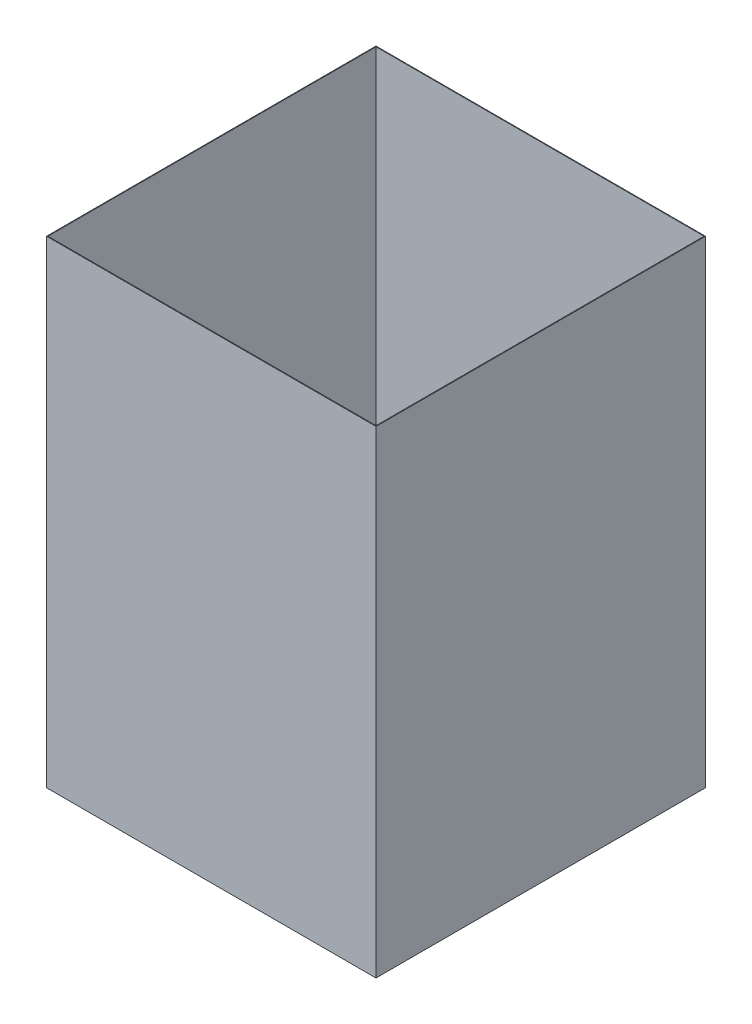
ISO-10303-21;
HEADER;
FILE_DESCRIPTION(('STEP AP214'),'2;1');
FILE_NAME('part.step','',(''),(''),'','','');
FILE_SCHEMA(('AUTOMOTIVE_DESIGN { 1 0 10303 214 1 1 1 1 }'));
ENDSEC;
DATA;
#1=APPLICATION_CONTEXT('core data for automotive mechanical design processes');
#2=APPLICATION_PROTOCOL_DEFINITION('international standard','automotive_design',2000,#1);
#3=PRODUCT_CONTEXT('',#1,'mechanical');
#4=PRODUCT('Part','Part','',(#3));
#5=PRODUCT_RELATED_PRODUCT_CATEGORY('part','',(#4));
#6=PRODUCT_DEFINITION_FORMATION('','',#4);
#7=PRODUCT_DEFINITION_CONTEXT('part definition',#1,'design');
#8=PRODUCT_DEFINITION('design','',#6,#7);
#9=PRODUCT_DEFINITION_SHAPE('','',#8);
#10=(LENGTH_UNIT() NAMED_UNIT(*) SI_UNIT(.MILLI.,.METRE.));
#11=(NAMED_UNIT(*) PLANE_ANGLE_UNIT() SI_UNIT($,.RADIAN.));
#12=(NAMED_UNIT(*) SI_UNIT($,.STERADIAN.) SOLID_ANGLE_UNIT());
#13=UNCERTAINTY_MEASURE_WITH_UNIT(LENGTH_MEASURE(1.E-05),#10,'distance_accuracy_value','');
#14=(GEOMETRIC_REPRESENTATION_CONTEXT(3) GLOBAL_UNCERTAINTY_ASSIGNED_CONTEXT((#13)) GLOBAL_UNIT_ASSIGNED_CONTEXT((#10,
#11,#12)) REPRESENTATION_CONTEXT('',''));
#15=CARTESIAN_POINT('',(0.,0.,0.));
#16=DIRECTION('',(0.,0.,1.));
#17=DIRECTION('',(1.,0.,0.));
#18=AXIS2_PLACEMENT_3D('',#15,#16,#17);
#19=CARTESIAN_POINT('',(100.,290.,-100.));
#20=DIRECTION('',(-1.,0.,0.));
#21=DIRECTION('',(0.,0.,1.));
#22=AXIS2_PLACEMENT_3D('',#19,#20,#21);
#23=PLANE('',#22);
#24=DIRECTION('',(0.,0.,-1.));
#25=VECTOR('',#24,1.);
#26=CARTESIAN_POINT('',(100.,0.,-100.));
#27=LINE('',#26,#25);
#28=CARTESIAN_POINT('',(100.,0.,100.));
#29=VERTEX_POINT('',#28);
#30=CARTESIAN_POINT('',(100.,0.,-100.));
#31=VERTEX_POINT('',#30);
#32=EDGE_CURVE('E147',#29,#31,#27,.T.);
#33=ORIENTED_EDGE('',*,*,#32,.T.);
#34=DIRECTION('',(0.,-1.,0.));
#35=VECTOR('',#34,1.);
#36=CARTESIAN_POINT('',(100.,290.,-100.));
#37=LINE('',#36,#35);
#38=CARTESIAN_POINT('',(100.,290.,-100.));
#39=VERTEX_POINT('',#38);
#40=EDGE_CURVE('E11',#39,#31,#37,.T.);
#41=ORIENTED_EDGE('',*,*,#40,.F.);
#42=DIRECTION('',(0.,0.,-1.));
#43=VECTOR('',#42,1.);
#44=CARTESIAN_POINT('',(100.,290.,-100.));
#45=LINE('',#44,#43);
#46=CARTESIAN_POINT('',(100.,290.,100.));
#47=VERTEX_POINT('',#46);
#48=EDGE_CURVE('E140',#47,#39,#45,.T.);
#49=ORIENTED_EDGE('',*,*,#48,.F.);
#50=DIRECTION('',(0.,-1.,0.));
#51=VECTOR('',#50,1.);
#52=CARTESIAN_POINT('',(100.,290.,100.));
#53=LINE('',#52,#51);
#54=EDGE_CURVE('E146',#47,#29,#53,.T.);
#55=ORIENTED_EDGE('',*,*,#54,.T.);
#56=EDGE_LOOP('',(#33,#41,#49,#55));
#57=FACE_BOUND('',#56,.T.);
#58=ADVANCED_FACE('F33',(#57),#23,.F.);
#59=CARTESIAN_POINT('',(-100.,290.,-99.9999999999999));
#60=DIRECTION('',(0.,0.,1.));
#61=DIRECTION('',(1.,0.,0.));
#62=AXIS2_PLACEMENT_3D('',#59,#60,#61);
#63=PLANE('',#62);
#64=DIRECTION('',(-1.,0.,0.));
#65=VECTOR('',#64,1.);
#66=CARTESIAN_POINT('',(-100.,0.,-99.9999999999999));
#67=LINE('',#66,#65);
#68=CARTESIAN_POINT('',(-100.,0.,-99.9999999999999));
#69=VERTEX_POINT('',#68);
#70=EDGE_CURVE('E150',#31,#69,#67,.T.);
#71=ORIENTED_EDGE('',*,*,#70,.T.);
#72=DIRECTION('',(0.,-1.,0.));
#73=VECTOR('',#72,1.);
#74=CARTESIAN_POINT('',(-100.,290.,-99.9999999999999));
#75=LINE('',#74,#73);
#76=CARTESIAN_POINT('',(-100.,290.,-99.9999999999999));
#77=VERTEX_POINT('',#76);
#78=EDGE_CURVE('E40',#77,#69,#75,.T.);
#79=ORIENTED_EDGE('',*,*,#78,.F.);
#80=DIRECTION('',(-1.,0.,0.));
#81=VECTOR('',#80,1.);
#82=CARTESIAN_POINT('',(-100.,290.,-99.9999999999999));
#83=LINE('',#82,#81);
#84=EDGE_CURVE('E84',#39,#77,#83,.T.);
#85=ORIENTED_EDGE('',*,*,#84,.F.);
#86=ORIENTED_EDGE('',*,*,#40,.T.);
#87=EDGE_LOOP('',(#71,#79,#85,#86));
#88=FACE_BOUND('',#87,.T.);
#89=ADVANCED_FACE('F179',(#88),#63,.F.);
#90=CARTESIAN_POINT('',(-100.,290.,-99.9999999999999));
#91=DIRECTION('',(1.,0.,0.));
#92=DIRECTION('',(0.,0.,-1.));
#93=AXIS2_PLACEMENT_3D('',#90,#91,#92);
#94=PLANE('',#93);
#95=DIRECTION('',(0.,0.,1.));
#96=VECTOR('',#95,1.);
#97=CARTESIAN_POINT('',(-100.,0.,-99.9999999999999));
#98=LINE('',#97,#96);
#99=CARTESIAN_POINT('',(-100.,0.,100.));
#100=VERTEX_POINT('',#99);
#101=EDGE_CURVE('E152',#69,#100,#98,.T.);
#102=ORIENTED_EDGE('',*,*,#101,.T.);
#103=DIRECTION('',(0.,-1.,0.));
#104=VECTOR('',#103,1.);
#105=CARTESIAN_POINT('',(-100.,290.,100.));
#106=LINE('',#105,#104);
#107=CARTESIAN_POINT('',(-100.,290.,100.));
#108=VERTEX_POINT('',#107);
#109=EDGE_CURVE('E156',#108,#100,#106,.T.);
#110=ORIENTED_EDGE('',*,*,#109,.F.);
#111=DIRECTION('',(0.,0.,1.));
#112=VECTOR('',#111,1.);
#113=CARTESIAN_POINT('',(-100.,290.,-99.9999999999999));
#114=LINE('',#113,#112);
#115=EDGE_CURVE('E143',#77,#108,#114,.T.);
#116=ORIENTED_EDGE('',*,*,#115,.F.);
#117=ORIENTED_EDGE('',*,*,#78,.T.);
#118=EDGE_LOOP('',(#102,#110,#116,#117));
#119=FACE_BOUND('',#118,.T.);
#120=ADVANCED_FACE('F161',(#119),#94,.F.);
#121=CARTESIAN_POINT('',(-100.,290.,100.));
#122=DIRECTION('',(0.,0.,-1.));
#123=DIRECTION('',(-1.,0.,0.));
#124=AXIS2_PLACEMENT_3D('',#121,#122,#123);
#125=PLANE('',#124);
#126=DIRECTION('',(1.,0.,0.));
#127=VECTOR('',#126,1.);
#128=CARTESIAN_POINT('',(-100.,0.,100.));
#129=LINE('',#128,#127);
#130=EDGE_CURVE('E77',#100,#29,#129,.T.);
#131=ORIENTED_EDGE('',*,*,#130,.T.);
#132=ORIENTED_EDGE('',*,*,#54,.F.);
#133=DIRECTION('',(1.,0.,0.));
#134=VECTOR('',#133,1.);
#135=CARTESIAN_POINT('',(-100.,290.,100.));
#136=LINE('',#135,#134);
#137=EDGE_CURVE('E56',#108,#47,#136,.T.);
#138=ORIENTED_EDGE('',*,*,#137,.F.);
#139=ORIENTED_EDGE('',*,*,#109,.T.);
#140=EDGE_LOOP('',(#131,#132,#138,#139));
#141=FACE_BOUND('',#140,.T.);
#142=ADVANCED_FACE('F169',(#141),#125,.F.);
#143=CARTESIAN_POINT('',(0.,290.,0.));
#144=DIRECTION('',(0.,1.,0.));
#145=DIRECTION('',(0.,0.,1.));
#146=AXIS2_PLACEMENT_3D('',#143,#144,#145);
#147=PLANE('',#146);
#148=DIRECTION('',(0.,0.,-1.));
#149=VECTOR('',#148,1.);
#150=CARTESIAN_POINT('',(99.6,290.,-100.));
#151=LINE('',#150,#149);
#152=CARTESIAN_POINT('',(99.6000000000001,290.,99.6));
#153=VERTEX_POINT('',#152);
#154=CARTESIAN_POINT('',(99.6,290.,-99.6));
#155=VERTEX_POINT('',#154);
#156=EDGE_CURVE('E129',#153,#155,#151,.T.);
#157=ORIENTED_EDGE('',*,*,#156,.F.);
#158=DIRECTION('',(1.,0.,0.));
#159=VECTOR('',#158,1.);
#160=CARTESIAN_POINT('',(-100.,290.,99.6));
#161=LINE('',#160,#159);
#162=CARTESIAN_POINT('',(-99.6,290.,99.6));
#163=VERTEX_POINT('',#162);
#164=EDGE_CURVE('E138',#163,#153,#161,.T.);
#165=ORIENTED_EDGE('',*,*,#164,.F.);
#166=DIRECTION('',(0.,0.,1.));
#167=VECTOR('',#166,1.);
#168=CARTESIAN_POINT('',(-99.6,290.,-99.9999999999999));
#169=LINE('',#168,#167);
#170=CARTESIAN_POINT('',(-99.6,290.,-99.6));
#171=VERTEX_POINT('',#170);
#172=EDGE_CURVE('E136',#171,#163,#169,.T.);
#173=ORIENTED_EDGE('',*,*,#172,.F.);
#174=DIRECTION('',(-1.,0.,0.));
#175=VECTOR('',#174,1.);
#176=CARTESIAN_POINT('',(-100.,290.,-99.6));
#177=LINE('',#176,#175);
#178=EDGE_CURVE('E121',#155,#171,#177,.T.);
#179=ORIENTED_EDGE('',*,*,#178,.F.);
#180=EDGE_LOOP('',(#157,#165,#173,#179));
#181=FACE_BOUND('',#180,.T.);
#182=ORIENTED_EDGE('',*,*,#48,.T.);
#183=ORIENTED_EDGE('',*,*,#84,.T.);
#184=ORIENTED_EDGE('',*,*,#115,.T.);
#185=ORIENTED_EDGE('',*,*,#137,.T.);
#186=EDGE_LOOP('',(#182,#183,#184,#185));
#187=FACE_BOUND('',#186,.T.);
#188=ADVANCED_FACE('F171',(#181,#187),#147,.T.);
#189=CARTESIAN_POINT('',(0.,0.,0.));
#190=DIRECTION('',(0.,1.,0.));
#191=DIRECTION('',(0.,0.,1.));
#192=AXIS2_PLACEMENT_3D('',#189,#190,#191);
#193=PLANE('',#192);
#194=ORIENTED_EDGE('',*,*,#32,.F.);
#195=ORIENTED_EDGE('',*,*,#130,.F.);
#196=ORIENTED_EDGE('',*,*,#101,.F.);
#197=ORIENTED_EDGE('',*,*,#70,.F.);
#198=EDGE_LOOP('',(#194,#195,#196,#197));
#199=FACE_BOUND('',#198,.T.);
#200=ADVANCED_FACE('F165',(#199),#193,.F.);
#201=CARTESIAN_POINT('',(99.6,290.,-100.));
#202=DIRECTION('',(-1.,0.,0.));
#203=DIRECTION('',(0.,0.,1.));
#204=AXIS2_PLACEMENT_3D('',#201,#202,#203);
#205=PLANE('',#204);
#206=DIRECTION('',(0.,0.,-1.));
#207=VECTOR('',#206,1.);
#208=CARTESIAN_POINT('',(99.6,0.400000000000011,-100.));
#209=LINE('',#208,#207);
#210=CARTESIAN_POINT('',(99.6000000000001,0.4,99.6));
#211=VERTEX_POINT('',#210);
#212=CARTESIAN_POINT('',(99.6,0.4,-99.6));
#213=VERTEX_POINT('',#212);
#214=EDGE_CURVE('E112',#211,#213,#209,.T.);
#215=ORIENTED_EDGE('',*,*,#214,.F.);
#216=DIRECTION('',(0.,-1.,0.));
#217=VECTOR('',#216,1.);
#218=CARTESIAN_POINT('',(99.6000000000001,290.,99.6));
#219=LINE('',#218,#217);
#220=EDGE_CURVE('E132',#153,#211,#219,.T.);
#221=ORIENTED_EDGE('',*,*,#220,.F.);
#222=ORIENTED_EDGE('',*,*,#156,.T.);
#223=DIRECTION('',(0.,-1.,0.));
#224=VECTOR('',#223,1.);
#225=CARTESIAN_POINT('',(99.6,290.,-99.6));
#226=LINE('',#225,#224);
#227=EDGE_CURVE('E124',#155,#213,#226,.T.);
#228=ORIENTED_EDGE('',*,*,#227,.T.);
#229=EDGE_LOOP('',(#215,#221,#222,#228));
#230=FACE_BOUND('',#229,.T.);
#231=ADVANCED_FACE('F206',(#230),#205,.T.);
#232=CARTESIAN_POINT('',(-100.,290.,-99.6));
#233=DIRECTION('',(0.,0.,1.));
#234=DIRECTION('',(1.,0.,0.));
#235=AXIS2_PLACEMENT_3D('',#232,#233,#234);
#236=PLANE('',#235);
#237=DIRECTION('',(-1.,0.,0.));
#238=VECTOR('',#237,1.);
#239=CARTESIAN_POINT('',(-100.,0.400000000000011,-99.6));
#240=LINE('',#239,#238);
#241=CARTESIAN_POINT('',(-99.6,0.4,-99.6));
#242=VERTEX_POINT('',#241);
#243=EDGE_CURVE('E106',#213,#242,#240,.T.);
#244=ORIENTED_EDGE('',*,*,#243,.F.);
#245=ORIENTED_EDGE('',*,*,#227,.F.);
#246=ORIENTED_EDGE('',*,*,#178,.T.);
#247=DIRECTION('',(0.,-1.,0.));
#248=VECTOR('',#247,1.);
#249=CARTESIAN_POINT('',(-99.6,290.,-99.6));
#250=LINE('',#249,#248);
#251=EDGE_CURVE('E118',#171,#242,#250,.T.);
#252=ORIENTED_EDGE('',*,*,#251,.T.);
#253=EDGE_LOOP('',(#244,#245,#246,#252));
#254=FACE_BOUND('',#253,.T.);
#255=ADVANCED_FACE('F119',(#254),#236,.T.);
#256=CARTESIAN_POINT('',(-99.6,290.,-99.9999999999999));
#257=DIRECTION('',(1.,0.,0.));
#258=DIRECTION('',(0.,0.,-1.));
#259=AXIS2_PLACEMENT_3D('',#256,#257,#258);
#260=PLANE('',#259);
#261=DIRECTION('',(0.,0.,1.));
#262=VECTOR('',#261,1.);
#263=CARTESIAN_POINT('',(-99.6,0.400000000000011,-99.9999999999999));
#264=LINE('',#263,#262);
#265=CARTESIAN_POINT('',(-99.6,0.4,99.6));
#266=VERTEX_POINT('',#265);
#267=EDGE_CURVE('E110',#242,#266,#264,.T.);
#268=ORIENTED_EDGE('',*,*,#267,.F.);
#269=ORIENTED_EDGE('',*,*,#251,.F.);
#270=ORIENTED_EDGE('',*,*,#172,.T.);
#271=DIRECTION('',(0.,-1.,0.));
#272=VECTOR('',#271,1.);
#273=CARTESIAN_POINT('',(-99.6,290.,99.6));
#274=LINE('',#273,#272);
#275=EDGE_CURVE('E47',#163,#266,#274,.T.);
#276=ORIENTED_EDGE('',*,*,#275,.T.);
#277=EDGE_LOOP('',(#268,#269,#270,#276));
#278=FACE_BOUND('',#277,.T.);
#279=ADVANCED_FACE('F126',(#278),#260,.T.);
#280=CARTESIAN_POINT('',(-100.,290.,99.6));
#281=DIRECTION('',(0.,0.,-1.));
#282=DIRECTION('',(-1.,0.,0.));
#283=AXIS2_PLACEMENT_3D('',#280,#281,#282);
#284=PLANE('',#283);
#285=DIRECTION('',(1.,0.,0.));
#286=VECTOR('',#285,1.);
#287=CARTESIAN_POINT('',(-100.,0.400000000000011,99.6));
#288=LINE('',#287,#286);
#289=EDGE_CURVE('E127',#266,#211,#288,.T.);
#290=ORIENTED_EDGE('',*,*,#289,.F.);
#291=ORIENTED_EDGE('',*,*,#275,.F.);
#292=ORIENTED_EDGE('',*,*,#164,.T.);
#293=ORIENTED_EDGE('',*,*,#220,.T.);
#294=EDGE_LOOP('',(#290,#291,#292,#293));
#295=FACE_BOUND('',#294,.T.);
#296=ADVANCED_FACE('F236',(#295),#284,.T.);
#297=CARTESIAN_POINT('',(0.,0.4,0.));
#298=DIRECTION('',(0.,1.,0.));
#299=DIRECTION('',(0.,0.,1.));
#300=AXIS2_PLACEMENT_3D('',#297,#298,#299);
#301=PLANE('',#300);
#302=ORIENTED_EDGE('',*,*,#214,.T.);
#303=ORIENTED_EDGE('',*,*,#243,.T.);
#304=ORIENTED_EDGE('',*,*,#267,.T.);
#305=ORIENTED_EDGE('',*,*,#289,.T.);
#306=EDGE_LOOP('',(#302,#303,#304,#305));
#307=FACE_BOUND('',#306,.T.);
#308=ADVANCED_FACE('F108',(#307),#301,.T.);
#309=CLOSED_SHELL('',(#58,#89,#120,#142,#188,#200,#231,#255,#279,#296,#308));
#310=MANIFOLD_SOLID_BREP('B2',#309);
#311=ADVANCED_BREP_SHAPE_REPRESENTATION('',(#18,#310),#14);
#312=SHAPE_DEFINITION_REPRESENTATION(#9,#311);
ENDSEC;
END-ISO-10303-21;
